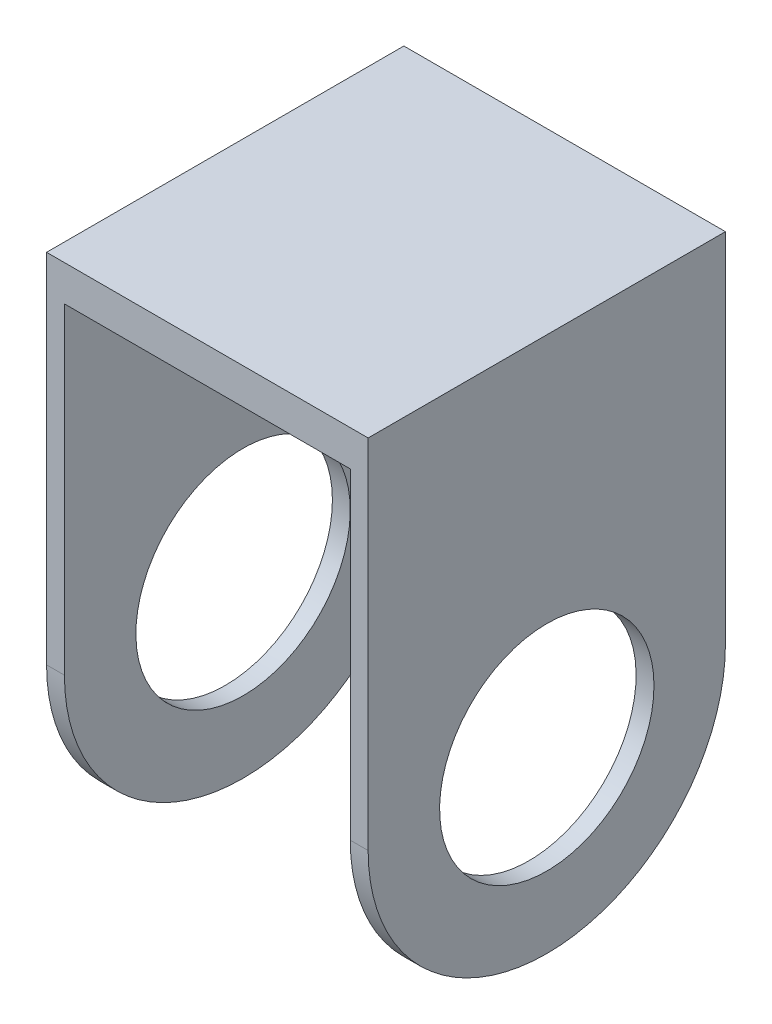
ISO-10303-21;
HEADER;
FILE_DESCRIPTION(('STEP AP214'),'2;1');
FILE_NAME('part.step','',(''),(''),'','','');
FILE_SCHEMA(('AUTOMOTIVE_DESIGN { 1 0 10303 214 1 1 1 1 }'));
ENDSEC;
DATA;
#1=APPLICATION_CONTEXT('core data for automotive mechanical design processes');
#2=APPLICATION_PROTOCOL_DEFINITION('international standard','automotive_design',2000,#1);
#3=PRODUCT_CONTEXT('',#1,'mechanical');
#4=PRODUCT('Part','Part','',(#3));
#5=PRODUCT_RELATED_PRODUCT_CATEGORY('part','',(#4));
#6=PRODUCT_DEFINITION_FORMATION('','',#4);
#7=PRODUCT_DEFINITION_CONTEXT('part definition',#1,'design');
#8=PRODUCT_DEFINITION('design','',#6,#7);
#9=PRODUCT_DEFINITION_SHAPE('','',#8);
#10=(LENGTH_UNIT() NAMED_UNIT(*) SI_UNIT(.MILLI.,.METRE.));
#11=(NAMED_UNIT(*) PLANE_ANGLE_UNIT() SI_UNIT($,.RADIAN.));
#12=(NAMED_UNIT(*) SI_UNIT($,.STERADIAN.) SOLID_ANGLE_UNIT());
#13=UNCERTAINTY_MEASURE_WITH_UNIT(LENGTH_MEASURE(1.E-05),#10,'distance_accuracy_value','');
#14=(GEOMETRIC_REPRESENTATION_CONTEXT(3) GLOBAL_UNCERTAINTY_ASSIGNED_CONTEXT((#13)) GLOBAL_UNIT_ASSIGNED_CONTEXT((#10,
#11,#12)) REPRESENTATION_CONTEXT('',''));
#15=CARTESIAN_POINT('',(0.,0.,0.));
#16=DIRECTION('',(0.,0.,1.));
#17=DIRECTION('',(1.,0.,0.));
#18=AXIS2_PLACEMENT_3D('',#15,#16,#17);
#19=CARTESIAN_POINT('',(9.,4.39974929303851,6.64420421363949));
#20=DIRECTION('',(-1.,0.,0.));
#21=DIRECTION('',(0.,0.,1.));
#22=AXIS2_PLACEMENT_3D('',#19,#20,#21);
#23=CYLINDRICAL_SURFACE('',#22,5.);
#24=DIRECTION('',(-1.,0.,0.));
#25=VECTOR('',#24,1.);
#26=CARTESIAN_POINT('',(9.,4.39974929303851,1.64420421363949));
#27=LINE('',#26,#25);
#28=CARTESIAN_POINT('',(0.499999999999997,4.39974929303851,1.64420421363949));
#29=VERTEX_POINT('',#28);
#30=CARTESIAN_POINT('',(0.,4.39974929303851,1.64420421363949));
#31=VERTEX_POINT('',#30);
#32=EDGE_CURVE('E168',#29,#31,#27,.T.);
#33=ORIENTED_EDGE('',*,*,#32,.F.);
#34=CARTESIAN_POINT('',(0.499999999999997,4.39974929303851,6.64420421363949));
#35=DIRECTION('',(-1.,0.,0.));
#36=DIRECTION('',(0.,-1.,0.));
#37=AXIS2_PLACEMENT_3D('',#34,#35,#36);
#38=CIRCLE('',#37,5.);
#39=CARTESIAN_POINT('',(0.499999999999997,4.39974929303851,11.6442042136395));
#40=VERTEX_POINT('',#39);
#41=EDGE_CURVE('E136',#29,#40,#38,.T.);
#42=ORIENTED_EDGE('',*,*,#41,.T.);
#43=DIRECTION('',(-1.,0.,0.));
#44=VECTOR('',#43,1.);
#45=CARTESIAN_POINT('',(9.,4.39974929303851,11.6442042136395));
#46=LINE('',#45,#44);
#47=CARTESIAN_POINT('',(0.,4.39974929303851,11.6442042136395));
#48=VERTEX_POINT('',#47);
#49=EDGE_CURVE('E170',#40,#48,#46,.T.);
#50=ORIENTED_EDGE('',*,*,#49,.T.);
#51=CARTESIAN_POINT('',(0.,4.39974929303851,6.64420421363949));
#52=DIRECTION('',(1.,0.,0.));
#53=DIRECTION('',(0.,0.,1.));
#54=AXIS2_PLACEMENT_3D('',#51,#52,#53);
#55=CIRCLE('',#54,5.);
#56=EDGE_CURVE('E163',#48,#31,#55,.T.);
#57=ORIENTED_EDGE('',*,*,#56,.T.);
#58=EDGE_LOOP('',(#33,#42,#50,#57));
#59=FACE_BOUND('',#58,.T.);
#60=ADVANCED_FACE('F33',(#59),#23,.T.);
#61=CARTESIAN_POINT('',(9.,4.39974929303851,6.64420421363949));
#62=DIRECTION('',(-1.,0.,0.));
#63=DIRECTION('',(0.,0.,1.));
#64=AXIS2_PLACEMENT_3D('',#61,#62,#63);
#65=CYLINDRICAL_SURFACE('',#64,3.);
#66=CARTESIAN_POINT('',(0.499999999999997,4.39974929303851,6.64420421363949));
#67=DIRECTION('',(-1.,0.,0.));
#68=DIRECTION('',(0.,-1.,0.));
#69=AXIS2_PLACEMENT_3D('',#66,#67,#68);
#70=CIRCLE('',#69,3.);
#71=CARTESIAN_POINT('',(0.499999999999996,1.39974929303851,6.64420421363949));
#72=VERTEX_POINT('',#71);
#73=EDGE_CURVE('E37',#72,#72,#70,.T.);
#74=ORIENTED_EDGE('',*,*,#73,.F.);
#75=EDGE_LOOP('',(#74));
#76=FACE_BOUND('',#75,.T.);
#77=CARTESIAN_POINT('',(0.,4.39974929303851,6.64420421363949));
#78=DIRECTION('',(1.,0.,0.));
#79=DIRECTION('',(0.,0.,-1.));
#80=AXIS2_PLACEMENT_3D('',#77,#78,#79);
#81=CIRCLE('',#80,3.);
#82=CARTESIAN_POINT('',(0.,4.39974929303851,3.64420421363949));
#83=VERTEX_POINT('',#82);
#84=EDGE_CURVE('E144',#83,#83,#81,.T.);
#85=ORIENTED_EDGE('',*,*,#84,.F.);
#86=EDGE_LOOP('',(#85));
#87=FACE_BOUND('',#86,.T.);
#88=ADVANCED_FACE('F180',(#76,#87),#65,.F.);
#89=CARTESIAN_POINT('',(9.,4.39974929303851,6.64420421363949));
#90=DIRECTION('',(-1.,0.,0.));
#91=DIRECTION('',(0.,0.,1.));
#92=AXIS2_PLACEMENT_3D('',#89,#90,#91);
#93=PLANE('',#92);
#94=DIRECTION('',(0.,0.,1.));
#95=VECTOR('',#94,1.);
#96=CARTESIAN_POINT('',(9.,14.3997492930385,11.6442042136395));
#97=LINE('',#96,#95);
#98=CARTESIAN_POINT('',(9.,14.3997492930385,1.64420421363949));
#99=VERTEX_POINT('',#98);
#100=CARTESIAN_POINT('',(9.,14.3997492930385,11.6442042136395));
#101=VERTEX_POINT('',#100);
#102=EDGE_CURVE('E151',#99,#101,#97,.T.);
#103=ORIENTED_EDGE('',*,*,#102,.T.);
#104=DIRECTION('',(0.,-1.,0.));
#105=VECTOR('',#104,1.);
#106=CARTESIAN_POINT('',(9.,4.39974929303851,11.6442042136395));
#107=LINE('',#106,#105);
#108=CARTESIAN_POINT('',(9.,4.39974929303851,11.6442042136395));
#109=VERTEX_POINT('',#108);
#110=EDGE_CURVE('E86',#101,#109,#107,.T.);
#111=ORIENTED_EDGE('',*,*,#110,.T.);
#112=CARTESIAN_POINT('',(9.,4.39974929303851,6.64420421363949));
#113=DIRECTION('',(1.,0.,0.));
#114=DIRECTION('',(0.,0.,1.));
#115=AXIS2_PLACEMENT_3D('',#112,#113,#114);
#116=CIRCLE('',#115,5.);
#117=CARTESIAN_POINT('',(9.,4.39974929303851,1.64420421363949));
#118=VERTEX_POINT('',#117);
#119=EDGE_CURVE('E154',#109,#118,#116,.T.);
#120=ORIENTED_EDGE('',*,*,#119,.T.);
#121=DIRECTION('',(0.,1.,0.));
#122=VECTOR('',#121,1.);
#123=CARTESIAN_POINT('',(9.,14.3997492930385,1.64420421363949));
#124=LINE('',#123,#122);
#125=EDGE_CURVE('E59',#118,#99,#124,.T.);
#126=ORIENTED_EDGE('',*,*,#125,.T.);
#127=EDGE_LOOP('',(#103,#111,#120,#126));
#128=FACE_BOUND('',#127,.T.);
#129=CARTESIAN_POINT('',(9.,4.39974929303851,6.64420421363949));
#130=DIRECTION('',(1.,0.,0.));
#131=DIRECTION('',(0.,0.,-1.));
#132=AXIS2_PLACEMENT_3D('',#129,#130,#131);
#133=CIRCLE('',#132,3.);
#134=CARTESIAN_POINT('',(9.,4.39974929303851,3.64420421363949));
#135=VERTEX_POINT('',#134);
#136=EDGE_CURVE('E145',#135,#135,#133,.T.);
#137=ORIENTED_EDGE('',*,*,#136,.F.);
#138=EDGE_LOOP('',(#137));
#139=FACE_BOUND('',#138,.T.);
#140=ADVANCED_FACE('F183',(#128,#139),#93,.F.);
#141=CARTESIAN_POINT('',(0.,4.39974929303851,6.64420421363949));
#142=DIRECTION('',(-1.,0.,0.));
#143=DIRECTION('',(0.,0.,1.));
#144=AXIS2_PLACEMENT_3D('',#141,#142,#143);
#145=PLANE('',#144);
#146=DIRECTION('',(0.,0.,1.));
#147=VECTOR('',#146,1.);
#148=CARTESIAN_POINT('',(0.,14.3997492930385,11.6442042136395));
#149=LINE('',#148,#147);
#150=CARTESIAN_POINT('',(0.,14.3997492930385,1.64420421363949));
#151=VERTEX_POINT('',#150);
#152=CARTESIAN_POINT('',(0.,14.3997492930385,11.6442042136395));
#153=VERTEX_POINT('',#152);
#154=EDGE_CURVE('E148',#151,#153,#149,.T.);
#155=ORIENTED_EDGE('',*,*,#154,.F.);
#156=DIRECTION('',(0.,1.,0.));
#157=VECTOR('',#156,1.);
#158=CARTESIAN_POINT('',(0.,14.3997492930385,1.64420421363949));
#159=LINE('',#158,#157);
#160=EDGE_CURVE('E79',#31,#151,#159,.T.);
#161=ORIENTED_EDGE('',*,*,#160,.F.);
#162=ORIENTED_EDGE('',*,*,#56,.F.);
#163=DIRECTION('',(0.,-1.,0.));
#164=VECTOR('',#163,1.);
#165=CARTESIAN_POINT('',(0.,4.39974929303851,11.6442042136395));
#166=LINE('',#165,#164);
#167=EDGE_CURVE('E160',#153,#48,#166,.T.);
#168=ORIENTED_EDGE('',*,*,#167,.F.);
#169=EDGE_LOOP('',(#155,#161,#162,#168));
#170=FACE_BOUND('',#169,.T.);
#171=ORIENTED_EDGE('',*,*,#84,.T.);
#172=EDGE_LOOP('',(#171));
#173=FACE_BOUND('',#172,.T.);
#174=ADVANCED_FACE('F185',(#170,#173),#145,.T.);
#175=CARTESIAN_POINT('',(9.,14.3997492930385,11.6442042136395));
#176=DIRECTION('',(0.,-1.,0.));
#177=DIRECTION('',(0.,0.,-1.));
#178=AXIS2_PLACEMENT_3D('',#175,#176,#177);
#179=PLANE('',#178);
#180=ORIENTED_EDGE('',*,*,#154,.T.);
#181=DIRECTION('',(-1.,0.,0.));
#182=VECTOR('',#181,1.);
#183=CARTESIAN_POINT('',(9.,14.3997492930385,11.6442042136395));
#184=LINE('',#183,#182);
#185=EDGE_CURVE('E11',#101,#153,#184,.T.);
#186=ORIENTED_EDGE('',*,*,#185,.F.);
#187=ORIENTED_EDGE('',*,*,#102,.F.);
#188=DIRECTION('',(-1.,0.,0.));
#189=VECTOR('',#188,1.);
#190=CARTESIAN_POINT('',(9.,14.3997492930385,1.64420421363949));
#191=LINE('',#190,#189);
#192=EDGE_CURVE('E157',#99,#151,#191,.T.);
#193=ORIENTED_EDGE('',*,*,#192,.T.);
#194=EDGE_LOOP('',(#180,#186,#187,#193));
#195=FACE_BOUND('',#194,.T.);
#196=ADVANCED_FACE('F35',(#195),#179,.F.);
#197=CARTESIAN_POINT('',(9.,4.39974929303851,11.6442042136395));
#198=DIRECTION('',(0.,0.,-1.));
#199=DIRECTION('',(-1.,0.,0.));
#200=AXIS2_PLACEMENT_3D('',#197,#198,#199);
#201=PLANE('',#200);
#202=ORIENTED_EDGE('',*,*,#49,.F.);
#203=DIRECTION('',(0.,1.,0.));
#204=VECTOR('',#203,1.);
#205=CARTESIAN_POINT('',(0.499999999999997,4.39974929303851,11.6442042136395));
#206=LINE('',#205,#204);
#207=CARTESIAN_POINT('',(0.5,13.3997492930385,11.6442042136395));
#208=VERTEX_POINT('',#207);
#209=EDGE_CURVE('E139',#40,#208,#206,.T.);
#210=ORIENTED_EDGE('',*,*,#209,.T.);
#211=DIRECTION('',(1.,0.,0.));
#212=VECTOR('',#211,1.);
#213=CARTESIAN_POINT('',(9.,13.3997492930385,11.6442042136395));
#214=LINE('',#213,#212);
#215=CARTESIAN_POINT('',(8.5,13.3997492930385,11.6442042136395));
#216=VERTEX_POINT('',#215);
#217=EDGE_CURVE('E142',#208,#216,#214,.T.);
#218=ORIENTED_EDGE('',*,*,#217,.T.);
#219=DIRECTION('',(0.,-1.,0.));
#220=VECTOR('',#219,1.);
#221=CARTESIAN_POINT('',(8.49999999999999,4.39974929303851,11.6442042136395));
#222=LINE('',#221,#220);
#223=CARTESIAN_POINT('',(8.49999999999999,4.39974929303851,11.6442042136395));
#224=VERTEX_POINT('',#223);
#225=EDGE_CURVE('E115',#216,#224,#222,.T.);
#226=ORIENTED_EDGE('',*,*,#225,.T.);
#227=EDGE_CURVE('E42',#109,#224,#46,.T.);
#228=ORIENTED_EDGE('',*,*,#227,.F.);
#229=ORIENTED_EDGE('',*,*,#110,.F.);
#230=ORIENTED_EDGE('',*,*,#185,.T.);
#231=ORIENTED_EDGE('',*,*,#167,.T.);
#232=EDGE_LOOP('',(#202,#210,#218,#226,#228,#229,#230,#231));
#233=FACE_BOUND('',#232,.T.);
#234=ADVANCED_FACE('F203',(#233),#201,.F.);
#235=ORIENTED_EDGE('',*,*,#227,.T.);
#236=CARTESIAN_POINT('',(8.49999999999999,4.39974929303851,6.64420421363949));
#237=DIRECTION('',(1.,0.,0.));
#238=DIRECTION('',(0.,1.,0.));
#239=AXIS2_PLACEMENT_3D('',#236,#237,#238);
#240=CIRCLE('',#239,5.);
#241=CARTESIAN_POINT('',(8.49999999999999,4.39974929303851,1.64420421363949));
#242=VERTEX_POINT('',#241);
#243=EDGE_CURVE('E133',#224,#242,#240,.T.);
#244=ORIENTED_EDGE('',*,*,#243,.T.);
#245=EDGE_CURVE('E128',#118,#242,#27,.T.);
#246=ORIENTED_EDGE('',*,*,#245,.F.);
#247=ORIENTED_EDGE('',*,*,#119,.F.);
#248=EDGE_LOOP('',(#235,#244,#246,#247));
#249=FACE_BOUND('',#248,.T.);
#250=ADVANCED_FACE('F197',(#249),#23,.T.);
#251=CARTESIAN_POINT('',(9.,14.3997492930385,1.64420421363949));
#252=DIRECTION('',(0.,0.,1.));
#253=DIRECTION('',(0.,-1.,0.));
#254=AXIS2_PLACEMENT_3D('',#251,#252,#253);
#255=PLANE('',#254);
#256=DIRECTION('',(1.,0.,0.));
#257=VECTOR('',#256,1.);
#258=CARTESIAN_POINT('',(0.5,13.3997492930385,1.64420421363949));
#259=LINE('',#258,#257);
#260=CARTESIAN_POINT('',(0.5,13.3997492930385,1.64420421363949));
#261=VERTEX_POINT('',#260);
#262=CARTESIAN_POINT('',(8.5,13.3997492930385,1.64420421363949));
#263=VERTEX_POINT('',#262);
#264=EDGE_CURVE('E122',#261,#263,#259,.T.);
#265=ORIENTED_EDGE('',*,*,#264,.F.);
#266=DIRECTION('',(0.,1.,0.));
#267=VECTOR('',#266,1.);
#268=CARTESIAN_POINT('',(0.5,13.3997492930385,1.64420421363949));
#269=LINE('',#268,#267);
#270=EDGE_CURVE('E50',#29,#261,#269,.T.);
#271=ORIENTED_EDGE('',*,*,#270,.F.);
#272=ORIENTED_EDGE('',*,*,#32,.T.);
#273=ORIENTED_EDGE('',*,*,#160,.T.);
#274=ORIENTED_EDGE('',*,*,#192,.F.);
#275=ORIENTED_EDGE('',*,*,#125,.F.);
#276=ORIENTED_EDGE('',*,*,#245,.T.);
#277=DIRECTION('',(0.,-1.,0.));
#278=VECTOR('',#277,1.);
#279=CARTESIAN_POINT('',(8.5,13.3997492930385,1.64420421363949));
#280=LINE('',#279,#278);
#281=EDGE_CURVE('E112',#263,#242,#280,.T.);
#282=ORIENTED_EDGE('',*,*,#281,.F.);
#283=EDGE_LOOP('',(#265,#271,#272,#273,#274,#275,#276,#282));
#284=FACE_BOUND('',#283,.T.);
#285=ADVANCED_FACE('F126',(#284),#255,.F.);
#286=CARTESIAN_POINT('',(8.49999999999999,4.39974929303851,6.64420421363949));
#287=DIRECTION('',(1.,0.,0.));
#288=DIRECTION('',(0.,1.,0.));
#289=AXIS2_PLACEMENT_3D('',#286,#287,#288);
#290=CIRCLE('',#289,3.);
#291=CARTESIAN_POINT('',(8.5,7.39974929303851,6.64420421363949));
#292=VERTEX_POINT('',#291);
#293=EDGE_CURVE('E118',#292,#292,#290,.T.);
#294=ORIENTED_EDGE('',*,*,#293,.F.);
#295=EDGE_LOOP('',(#294));
#296=FACE_BOUND('',#295,.T.);
#297=ORIENTED_EDGE('',*,*,#136,.T.);
#298=EDGE_LOOP('',(#297));
#299=FACE_BOUND('',#298,.T.);
#300=ADVANCED_FACE('F176',(#296,#299),#65,.F.);
#301=CARTESIAN_POINT('',(0.5,13.3997492930385,13.6442042136395));
#302=DIRECTION('',(0.,1.,0.));
#303=DIRECTION('',(0.,0.,1.));
#304=AXIS2_PLACEMENT_3D('',#301,#302,#303);
#305=PLANE('',#304);
#306=DIRECTION('',(0.,0.,-1.));
#307=VECTOR('',#306,1.);
#308=CARTESIAN_POINT('',(0.5,13.3997492930385,13.6442042136395));
#309=LINE('',#308,#307);
#310=EDGE_CURVE('E119',#208,#261,#309,.T.);
#311=ORIENTED_EDGE('',*,*,#310,.T.);
#312=ORIENTED_EDGE('',*,*,#264,.T.);
#313=DIRECTION('',(0.,0.,-1.));
#314=VECTOR('',#313,1.);
#315=CARTESIAN_POINT('',(8.5,13.3997492930385,13.6442042136395));
#316=LINE('',#315,#314);
#317=EDGE_CURVE('E108',#216,#263,#316,.T.);
#318=ORIENTED_EDGE('',*,*,#317,.F.);
#319=ORIENTED_EDGE('',*,*,#217,.F.);
#320=EDGE_LOOP('',(#311,#312,#318,#319));
#321=FACE_BOUND('',#320,.T.);
#322=ADVANCED_FACE('F123',(#321),#305,.F.);
#323=CARTESIAN_POINT('',(0.5,13.3997492930385,13.6442042136395));
#324=DIRECTION('',(-1.,0.,0.));
#325=DIRECTION('',(0.,-1.,0.));
#326=AXIS2_PLACEMENT_3D('',#323,#324,#325);
#327=PLANE('',#326);
#328=ORIENTED_EDGE('',*,*,#73,.T.);
#329=EDGE_LOOP('',(#328));
#330=FACE_BOUND('',#329,.T.);
#331=ORIENTED_EDGE('',*,*,#41,.F.);
#332=ORIENTED_EDGE('',*,*,#270,.T.);
#333=ORIENTED_EDGE('',*,*,#310,.F.);
#334=ORIENTED_EDGE('',*,*,#209,.F.);
#335=EDGE_LOOP('',(#331,#332,#333,#334));
#336=FACE_BOUND('',#335,.T.);
#337=ADVANCED_FACE('F211',(#330,#336),#327,.F.);
#338=CARTESIAN_POINT('',(8.5,13.3997492930385,13.6442042136395));
#339=DIRECTION('',(1.,0.,0.));
#340=DIRECTION('',(0.,1.,0.));
#341=AXIS2_PLACEMENT_3D('',#338,#339,#340);
#342=PLANE('',#341);
#343=ORIENTED_EDGE('',*,*,#293,.T.);
#344=EDGE_LOOP('',(#343));
#345=FACE_BOUND('',#344,.T.);
#346=ORIENTED_EDGE('',*,*,#317,.T.);
#347=ORIENTED_EDGE('',*,*,#281,.T.);
#348=ORIENTED_EDGE('',*,*,#243,.F.);
#349=ORIENTED_EDGE('',*,*,#225,.F.);
#350=EDGE_LOOP('',(#346,#347,#348,#349));
#351=FACE_BOUND('',#350,.T.);
#352=ADVANCED_FACE('F110',(#345,#351),#342,.F.);
#353=CLOSED_SHELL('',(#60,#88,#140,#174,#196,#234,#250,#285,#300,#322,#337,#352));
#354=MANIFOLD_SOLID_BREP('B2',#353);
#355=ADVANCED_BREP_SHAPE_REPRESENTATION('',(#18,#354),#14);
#356=SHAPE_DEFINITION_REPRESENTATION(#9,#355);
ENDSEC;
END-ISO-10303-21;
